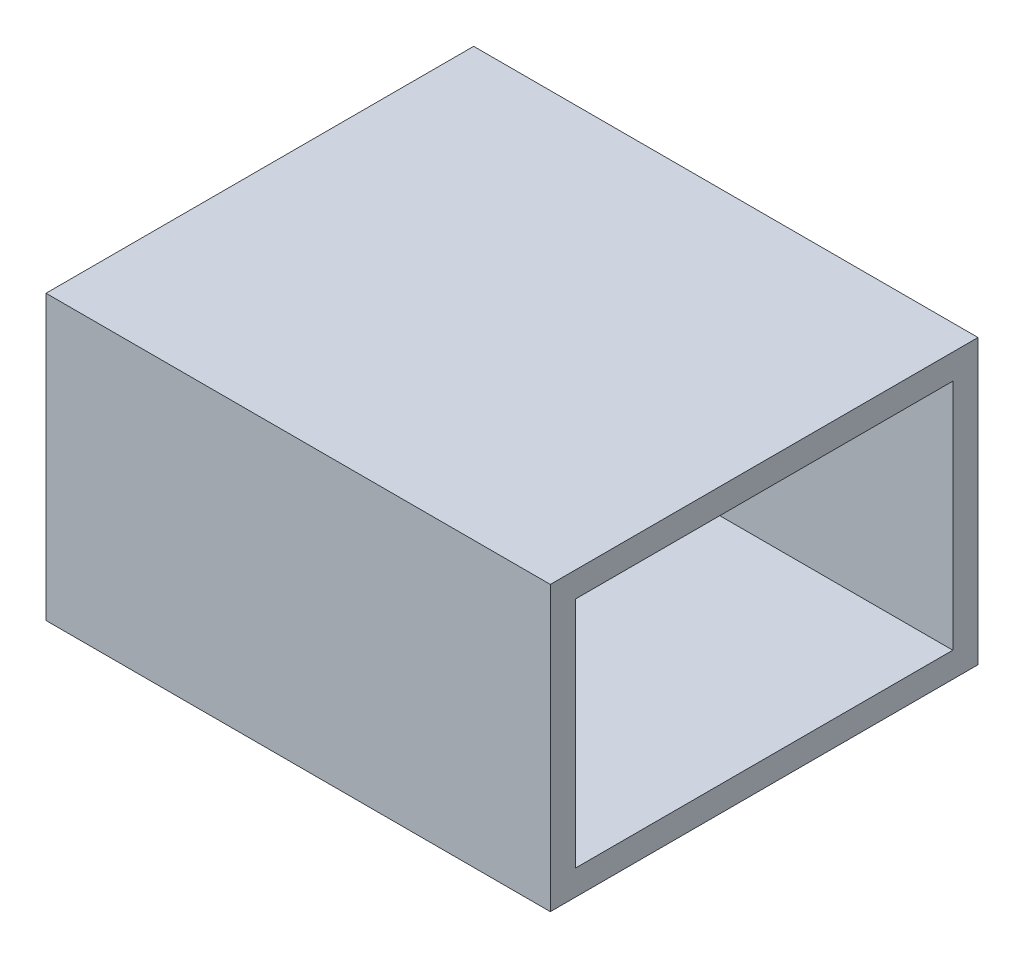
ISO-10303-21;
HEADER;
FILE_DESCRIPTION(('STEP AP214'),'2;1');
FILE_NAME('part.step','',(''),(''),'','','');
FILE_SCHEMA(('AUTOMOTIVE_DESIGN { 1 0 10303 214 1 1 1 1 }'));
ENDSEC;
DATA;
#1=APPLICATION_CONTEXT('core data for automotive mechanical design processes');
#2=APPLICATION_PROTOCOL_DEFINITION('international standard','automotive_design',2000,#1);
#3=PRODUCT_CONTEXT('',#1,'mechanical');
#4=PRODUCT('Part','Part','',(#3));
#5=PRODUCT_RELATED_PRODUCT_CATEGORY('part','',(#4));
#6=PRODUCT_DEFINITION_FORMATION('','',#4);
#7=PRODUCT_DEFINITION_CONTEXT('part definition',#1,'design');
#8=PRODUCT_DEFINITION('design','',#6,#7);
#9=PRODUCT_DEFINITION_SHAPE('','',#8);
#10=(LENGTH_UNIT() NAMED_UNIT(*) SI_UNIT(.MILLI.,.METRE.));
#11=(NAMED_UNIT(*) PLANE_ANGLE_UNIT() SI_UNIT($,.RADIAN.));
#12=(NAMED_UNIT(*) SI_UNIT($,.STERADIAN.) SOLID_ANGLE_UNIT());
#13=UNCERTAINTY_MEASURE_WITH_UNIT(LENGTH_MEASURE(1.E-05),#10,'distance_accuracy_value','');
#14=(GEOMETRIC_REPRESENTATION_CONTEXT(3) GLOBAL_UNCERTAINTY_ASSIGNED_CONTEXT((#13)) GLOBAL_UNIT_ASSIGNED_CONTEXT((#10,
#11,#12)) REPRESENTATION_CONTEXT('',''));
#15=CARTESIAN_POINT('',(0.,0.,0.));
#16=DIRECTION('',(0.,0.,1.));
#17=DIRECTION('',(1.,0.,0.));
#18=AXIS2_PLACEMENT_3D('',#15,#16,#17);
#19=CARTESIAN_POINT('',(254.,0.,0.));
#20=DIRECTION('',(-1.,0.,0.));
#21=DIRECTION('',(0.,0.,1.));
#22=AXIS2_PLACEMENT_3D('',#19,#20,#21);
#23=PLANE('',#22);
#24=DIRECTION('',(0.,1.,0.));
#25=VECTOR('',#24,1.);
#26=CARTESIAN_POINT('',(254.,12.7,-202.692));
#27=LINE('',#26,#25);
#28=CARTESIAN_POINT('',(254.,-130.048,-202.692));
#29=VERTEX_POINT('',#28);
#30=CARTESIAN_POINT('',(254.,12.7,-202.692));
#31=VERTEX_POINT('',#30);
#32=EDGE_CURVE('E134',#29,#31,#27,.T.);
#33=ORIENTED_EDGE('',*,*,#32,.T.);
#34=DIRECTION('',(0.,0.,1.));
#35=VECTOR('',#34,1.);
#36=CARTESIAN_POINT('',(254.,12.7,-202.692));
#37=LINE('',#36,#35);
#38=CARTESIAN_POINT('',(254.,12.7,12.7));
#39=VERTEX_POINT('',#38);
#40=EDGE_CURVE('E137',#31,#39,#37,.T.);
#41=ORIENTED_EDGE('',*,*,#40,.T.);
#42=DIRECTION('',(0.,-1.,0.));
#43=VECTOR('',#42,1.);
#44=CARTESIAN_POINT('',(254.,12.7,12.7));
#45=LINE('',#44,#43);
#46=CARTESIAN_POINT('',(254.,-130.048,12.7));
#47=VERTEX_POINT('',#46);
#48=EDGE_CURVE('E140',#39,#47,#45,.T.);
#49=ORIENTED_EDGE('',*,*,#48,.T.);
#50=DIRECTION('',(0.,0.,-1.));
#51=VECTOR('',#50,1.);
#52=CARTESIAN_POINT('',(254.,-130.048,-202.692));
#53=LINE('',#52,#51);
#54=EDGE_CURVE('E142',#47,#29,#53,.T.);
#55=ORIENTED_EDGE('',*,*,#54,.T.);
#56=EDGE_LOOP('',(#33,#41,#49,#55));
#57=FACE_BOUND('',#56,.T.);
#58=DIRECTION('',(0.,-1.,0.));
#59=VECTOR('',#58,1.);
#60=CARTESIAN_POINT('',(254.,0.,0.));
#61=LINE('',#60,#59);
#62=CARTESIAN_POINT('',(254.,0.,0.));
#63=VERTEX_POINT('',#62);
#64=CARTESIAN_POINT('',(254.,-117.348,0.));
#65=VERTEX_POINT('',#64);
#66=EDGE_CURVE('E98',#63,#65,#61,.T.);
#67=ORIENTED_EDGE('',*,*,#66,.F.);
#68=DIRECTION('',(0.,0.,1.));
#69=VECTOR('',#68,1.);
#70=CARTESIAN_POINT('',(254.,0.,0.));
#71=LINE('',#70,#69);
#72=CARTESIAN_POINT('',(254.,0.,-189.992));
#73=VERTEX_POINT('',#72);
#74=EDGE_CURVE('E120',#73,#63,#71,.T.);
#75=ORIENTED_EDGE('',*,*,#74,.F.);
#76=DIRECTION('',(0.,1.,0.));
#77=VECTOR('',#76,1.);
#78=CARTESIAN_POINT('',(254.,0.,-189.992));
#79=LINE('',#78,#77);
#80=CARTESIAN_POINT('',(254.,-117.348,-189.992));
#81=VERTEX_POINT('',#80);
#82=EDGE_CURVE('E118',#81,#73,#79,.T.);
#83=ORIENTED_EDGE('',*,*,#82,.F.);
#84=DIRECTION('',(0.,0.,-1.));
#85=VECTOR('',#84,1.);
#86=CARTESIAN_POINT('',(254.,-117.348,0.));
#87=LINE('',#86,#85);
#88=EDGE_CURVE('E106',#65,#81,#87,.T.);
#89=ORIENTED_EDGE('',*,*,#88,.F.);
#90=EDGE_LOOP('',(#67,#75,#83,#89));
#91=FACE_BOUND('',#90,.T.);
#92=ADVANCED_FACE('F33',(#57,#91),#23,.F.);
#93=CARTESIAN_POINT('',(0.,0.,0.));
#94=DIRECTION('',(-1.,0.,0.));
#95=DIRECTION('',(0.,0.,1.));
#96=AXIS2_PLACEMENT_3D('',#93,#94,#95);
#97=PLANE('',#96);
#98=DIRECTION('',(0.,1.,0.));
#99=VECTOR('',#98,1.);
#100=CARTESIAN_POINT('',(0.,12.7,-202.692));
#101=LINE('',#100,#99);
#102=CARTESIAN_POINT('',(0.,-130.048,-202.692));
#103=VERTEX_POINT('',#102);
#104=CARTESIAN_POINT('',(0.,12.7,-202.692));
#105=VERTEX_POINT('',#104);
#106=EDGE_CURVE('E114',#103,#105,#101,.T.);
#107=ORIENTED_EDGE('',*,*,#106,.F.);
#108=DIRECTION('',(0.,0.,-1.));
#109=VECTOR('',#108,1.);
#110=CARTESIAN_POINT('',(0.,-130.048,-202.692));
#111=LINE('',#110,#109);
#112=CARTESIAN_POINT('',(0.,-130.048,12.7));
#113=VERTEX_POINT('',#112);
#114=EDGE_CURVE('E138',#113,#103,#111,.T.);
#115=ORIENTED_EDGE('',*,*,#114,.F.);
#116=DIRECTION('',(0.,-1.,0.));
#117=VECTOR('',#116,1.);
#118=CARTESIAN_POINT('',(0.,12.7,12.7));
#119=LINE('',#118,#117);
#120=CARTESIAN_POINT('',(0.,12.7,12.7));
#121=VERTEX_POINT('',#120);
#122=EDGE_CURVE('E149',#121,#113,#119,.T.);
#123=ORIENTED_EDGE('',*,*,#122,.F.);
#124=DIRECTION('',(0.,0.,1.));
#125=VECTOR('',#124,1.);
#126=CARTESIAN_POINT('',(0.,12.7,-202.692));
#127=LINE('',#126,#125);
#128=EDGE_CURVE('E147',#105,#121,#127,.T.);
#129=ORIENTED_EDGE('',*,*,#128,.F.);
#130=EDGE_LOOP('',(#107,#115,#123,#129));
#131=FACE_BOUND('',#130,.T.);
#132=DIRECTION('',(0.,0.,1.));
#133=VECTOR('',#132,1.);
#134=CARTESIAN_POINT('',(0.,0.,0.));
#135=LINE('',#134,#133);
#136=CARTESIAN_POINT('',(0.,0.,-189.992));
#137=VERTEX_POINT('',#136);
#138=CARTESIAN_POINT('',(0.,0.,0.));
#139=VERTEX_POINT('',#138);
#140=EDGE_CURVE('E107',#137,#139,#135,.T.);
#141=ORIENTED_EDGE('',*,*,#140,.T.);
#142=DIRECTION('',(0.,-1.,0.));
#143=VECTOR('',#142,1.);
#144=CARTESIAN_POINT('',(0.,0.,0.));
#145=LINE('',#144,#143);
#146=CARTESIAN_POINT('',(0.,-117.348,0.));
#147=VERTEX_POINT('',#146);
#148=EDGE_CURVE('E56',#139,#147,#145,.T.);
#149=ORIENTED_EDGE('',*,*,#148,.T.);
#150=DIRECTION('',(0.,0.,-1.));
#151=VECTOR('',#150,1.);
#152=CARTESIAN_POINT('',(0.,-117.348,0.));
#153=LINE('',#152,#151);
#154=CARTESIAN_POINT('',(0.,-117.348,-189.992));
#155=VERTEX_POINT('',#154);
#156=EDGE_CURVE('E113',#147,#155,#153,.T.);
#157=ORIENTED_EDGE('',*,*,#156,.T.);
#158=DIRECTION('',(0.,1.,0.));
#159=VECTOR('',#158,1.);
#160=CARTESIAN_POINT('',(0.,0.,-189.992));
#161=LINE('',#160,#159);
#162=EDGE_CURVE('E126',#155,#137,#161,.T.);
#163=ORIENTED_EDGE('',*,*,#162,.T.);
#164=EDGE_LOOP('',(#141,#149,#157,#163));
#165=FACE_BOUND('',#164,.T.);
#166=ADVANCED_FACE('F167',(#131,#165),#97,.T.);
#167=CARTESIAN_POINT('',(254.,12.7,-202.692));
#168=DIRECTION('',(0.,0.,1.));
#169=DIRECTION('',(0.,-1.,0.));
#170=AXIS2_PLACEMENT_3D('',#167,#168,#169);
#171=PLANE('',#170);
#172=ORIENTED_EDGE('',*,*,#106,.T.);
#173=DIRECTION('',(-1.,0.,0.));
#174=VECTOR('',#173,1.);
#175=CARTESIAN_POINT('',(254.,12.7,-202.692));
#176=LINE('',#175,#174);
#177=EDGE_CURVE('E11',#31,#105,#176,.T.);
#178=ORIENTED_EDGE('',*,*,#177,.F.);
#179=ORIENTED_EDGE('',*,*,#32,.F.);
#180=DIRECTION('',(-1.,0.,0.));
#181=VECTOR('',#180,1.);
#182=CARTESIAN_POINT('',(254.,-130.048,-202.692));
#183=LINE('',#182,#181);
#184=EDGE_CURVE('E144',#29,#103,#183,.T.);
#185=ORIENTED_EDGE('',*,*,#184,.T.);
#186=EDGE_LOOP('',(#172,#178,#179,#185));
#187=FACE_BOUND('',#186,.T.);
#188=ADVANCED_FACE('F35',(#187),#171,.F.);
#189=CARTESIAN_POINT('',(254.,12.7,-202.692));
#190=DIRECTION('',(0.,-1.,0.));
#191=DIRECTION('',(0.,0.,-1.));
#192=AXIS2_PLACEMENT_3D('',#189,#190,#191);
#193=PLANE('',#192);
#194=ORIENTED_EDGE('',*,*,#128,.T.);
#195=DIRECTION('',(-1.,0.,0.));
#196=VECTOR('',#195,1.);
#197=CARTESIAN_POINT('',(254.,12.7,12.7));
#198=LINE('',#197,#196);
#199=EDGE_CURVE('E41',#39,#121,#198,.T.);
#200=ORIENTED_EDGE('',*,*,#199,.F.);
#201=ORIENTED_EDGE('',*,*,#40,.F.);
#202=ORIENTED_EDGE('',*,*,#177,.T.);
#203=EDGE_LOOP('',(#194,#200,#201,#202));
#204=FACE_BOUND('',#203,.T.);
#205=ADVANCED_FACE('F177',(#204),#193,.F.);
#206=CARTESIAN_POINT('',(254.,12.7,12.7));
#207=DIRECTION('',(0.,0.,-1.));
#208=DIRECTION('',(0.,1.,0.));
#209=AXIS2_PLACEMENT_3D('',#206,#207,#208);
#210=PLANE('',#209);
#211=ORIENTED_EDGE('',*,*,#122,.T.);
#212=DIRECTION('',(-1.,0.,0.));
#213=VECTOR('',#212,1.);
#214=CARTESIAN_POINT('',(254.,-130.048,12.7));
#215=LINE('',#214,#213);
#216=EDGE_CURVE('E154',#47,#113,#215,.T.);
#217=ORIENTED_EDGE('',*,*,#216,.F.);
#218=ORIENTED_EDGE('',*,*,#48,.F.);
#219=ORIENTED_EDGE('',*,*,#199,.T.);
#220=EDGE_LOOP('',(#211,#217,#218,#219));
#221=FACE_BOUND('',#220,.T.);
#222=ADVANCED_FACE('F161',(#221),#210,.F.);
#223=CARTESIAN_POINT('',(254.,-130.048,-202.692));
#224=DIRECTION('',(0.,1.,0.));
#225=DIRECTION('',(0.,0.,1.));
#226=AXIS2_PLACEMENT_3D('',#223,#224,#225);
#227=PLANE('',#226);
#228=ORIENTED_EDGE('',*,*,#114,.T.);
#229=ORIENTED_EDGE('',*,*,#184,.F.);
#230=ORIENTED_EDGE('',*,*,#54,.F.);
#231=ORIENTED_EDGE('',*,*,#216,.T.);
#232=EDGE_LOOP('',(#228,#229,#230,#231));
#233=FACE_BOUND('',#232,.T.);
#234=ADVANCED_FACE('F171',(#233),#227,.F.);
#235=CARTESIAN_POINT('',(254.,0.,0.));
#236=DIRECTION('',(0.,0.,-1.));
#237=DIRECTION('',(0.,1.,0.));
#238=AXIS2_PLACEMENT_3D('',#235,#236,#237);
#239=PLANE('',#238);
#240=ORIENTED_EDGE('',*,*,#148,.F.);
#241=DIRECTION('',(-1.,0.,0.));
#242=VECTOR('',#241,1.);
#243=CARTESIAN_POINT('',(254.,0.,0.));
#244=LINE('',#243,#242);
#245=EDGE_CURVE('E102',#63,#139,#244,.T.);
#246=ORIENTED_EDGE('',*,*,#245,.F.);
#247=ORIENTED_EDGE('',*,*,#66,.T.);
#248=DIRECTION('',(-1.,0.,0.));
#249=VECTOR('',#248,1.);
#250=CARTESIAN_POINT('',(254.,-117.348,0.));
#251=LINE('',#250,#249);
#252=EDGE_CURVE('E101',#65,#147,#251,.T.);
#253=ORIENTED_EDGE('',*,*,#252,.T.);
#254=EDGE_LOOP('',(#240,#246,#247,#253));
#255=FACE_BOUND('',#254,.T.);
#256=ADVANCED_FACE('F100',(#255),#239,.T.);
#257=CARTESIAN_POINT('',(254.,-117.348,0.));
#258=DIRECTION('',(0.,1.,0.));
#259=DIRECTION('',(0.,0.,1.));
#260=AXIS2_PLACEMENT_3D('',#257,#258,#259);
#261=PLANE('',#260);
#262=ORIENTED_EDGE('',*,*,#156,.F.);
#263=ORIENTED_EDGE('',*,*,#252,.F.);
#264=ORIENTED_EDGE('',*,*,#88,.T.);
#265=DIRECTION('',(-1.,0.,0.));
#266=VECTOR('',#265,1.);
#267=CARTESIAN_POINT('',(254.,-117.348,-189.992));
#268=LINE('',#267,#266);
#269=EDGE_CURVE('E115',#81,#155,#268,.T.);
#270=ORIENTED_EDGE('',*,*,#269,.T.);
#271=EDGE_LOOP('',(#262,#263,#264,#270));
#272=FACE_BOUND('',#271,.T.);
#273=ADVANCED_FACE('F110',(#272),#261,.T.);
#274=CARTESIAN_POINT('',(254.,0.,-189.992));
#275=DIRECTION('',(0.,0.,1.));
#276=DIRECTION('',(0.,-1.,0.));
#277=AXIS2_PLACEMENT_3D('',#274,#275,#276);
#278=PLANE('',#277);
#279=ORIENTED_EDGE('',*,*,#162,.F.);
#280=ORIENTED_EDGE('',*,*,#269,.F.);
#281=ORIENTED_EDGE('',*,*,#82,.T.);
#282=DIRECTION('',(-1.,0.,0.));
#283=VECTOR('',#282,1.);
#284=CARTESIAN_POINT('',(254.,0.,-189.992));
#285=LINE('',#284,#283);
#286=EDGE_CURVE('E48',#73,#137,#285,.T.);
#287=ORIENTED_EDGE('',*,*,#286,.T.);
#288=EDGE_LOOP('',(#279,#280,#281,#287));
#289=FACE_BOUND('',#288,.T.);
#290=ADVANCED_FACE('F200',(#289),#278,.T.);
#291=CARTESIAN_POINT('',(254.,0.,0.));
#292=DIRECTION('',(0.,-1.,0.));
#293=DIRECTION('',(0.,0.,-1.));
#294=AXIS2_PLACEMENT_3D('',#291,#292,#293);
#295=PLANE('',#294);
#296=ORIENTED_EDGE('',*,*,#140,.F.);
#297=ORIENTED_EDGE('',*,*,#286,.F.);
#298=ORIENTED_EDGE('',*,*,#74,.T.);
#299=ORIENTED_EDGE('',*,*,#245,.T.);
#300=EDGE_LOOP('',(#296,#297,#298,#299));
#301=FACE_BOUND('',#300,.T.);
#302=ADVANCED_FACE('F204',(#301),#295,.T.);
#303=CLOSED_SHELL('',(#92,#166,#188,#205,#222,#234,#256,#273,#290,#302));
#304=MANIFOLD_SOLID_BREP('B2',#303);
#305=ADVANCED_BREP_SHAPE_REPRESENTATION('',(#18,#304),#14);
#306=SHAPE_DEFINITION_REPRESENTATION(#9,#305);
ENDSEC;
END-ISO-10303-21;
